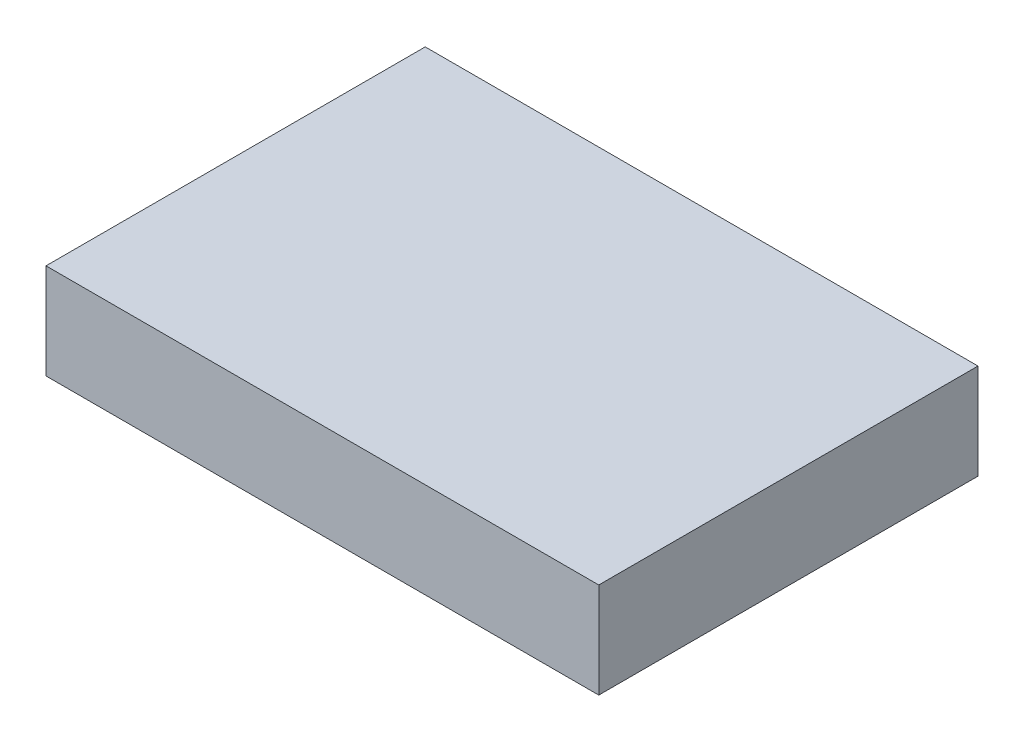
ISO-10303-21;
HEADER;
FILE_DESCRIPTION(('STEP AP214'),'2;1');
FILE_NAME('part.step','',(''),(''),'','','');
FILE_SCHEMA(('AUTOMOTIVE_DESIGN { 1 0 10303 214 1 1 1 1 }'));
ENDSEC;
DATA;
#1=APPLICATION_CONTEXT('core data for automotive mechanical design processes');
#2=APPLICATION_PROTOCOL_DEFINITION('international standard','automotive_design',2000,#1);
#3=PRODUCT_CONTEXT('',#1,'mechanical');
#4=PRODUCT('Part','Part','',(#3));
#5=PRODUCT_RELATED_PRODUCT_CATEGORY('part','',(#4));
#6=PRODUCT_DEFINITION_FORMATION('','',#4);
#7=PRODUCT_DEFINITION_CONTEXT('part definition',#1,'design');
#8=PRODUCT_DEFINITION('design','',#6,#7);
#9=PRODUCT_DEFINITION_SHAPE('','',#8);
#10=(LENGTH_UNIT() NAMED_UNIT(*) SI_UNIT(.MILLI.,.METRE.));
#11=(NAMED_UNIT(*) PLANE_ANGLE_UNIT() SI_UNIT($,.RADIAN.));
#12=(NAMED_UNIT(*) SI_UNIT($,.STERADIAN.) SOLID_ANGLE_UNIT());
#13=UNCERTAINTY_MEASURE_WITH_UNIT(LENGTH_MEASURE(1.E-05),#10,'distance_accuracy_value','');
#14=(GEOMETRIC_REPRESENTATION_CONTEXT(3) GLOBAL_UNCERTAINTY_ASSIGNED_CONTEXT((#13)) GLOBAL_UNIT_ASSIGNED_CONTEXT((#10,
#11,#12)) REPRESENTATION_CONTEXT('',''));
#15=CARTESIAN_POINT('',(0.,0.,0.));
#16=DIRECTION('',(0.,0.,1.));
#17=DIRECTION('',(1.,0.,0.));
#18=AXIS2_PLACEMENT_3D('',#15,#16,#17);
#19=CARTESIAN_POINT('',(0.,25.4,0.));
#20=DIRECTION('',(1.,0.,0.));
#21=DIRECTION('',(0.,0.,-1.));
#22=AXIS2_PLACEMENT_3D('',#19,#20,#21);
#23=PLANE('',#22);
#24=DIRECTION('',(0.,0.,1.));
#25=VECTOR('',#24,1.);
#26=CARTESIAN_POINT('',(0.,0.,0.));
#27=LINE('',#26,#25);
#28=CARTESIAN_POINT('',(0.,0.,-100.979479207466));
#29=VERTEX_POINT('',#28);
#30=CARTESIAN_POINT('',(0.,0.,0.));
#31=VERTEX_POINT('',#30);
#32=EDGE_CURVE('E94',#29,#31,#27,.T.);
#33=ORIENTED_EDGE('',*,*,#32,.T.);
#34=DIRECTION('',(0.,-1.,0.));
#35=VECTOR('',#34,1.);
#36=CARTESIAN_POINT('',(0.,25.4,0.));
#37=LINE('',#36,#35);
#38=CARTESIAN_POINT('',(0.,25.4,0.));
#39=VERTEX_POINT('',#38);
#40=EDGE_CURVE('E11',#39,#31,#37,.T.);
#41=ORIENTED_EDGE('',*,*,#40,.F.);
#42=DIRECTION('',(0.,0.,1.));
#43=VECTOR('',#42,1.);
#44=CARTESIAN_POINT('',(0.,25.4,0.));
#45=LINE('',#44,#43);
#46=CARTESIAN_POINT('',(0.,25.4,-100.979479207466));
#47=VERTEX_POINT('',#46);
#48=EDGE_CURVE('E82',#47,#39,#45,.T.);
#49=ORIENTED_EDGE('',*,*,#48,.F.);
#50=DIRECTION('',(0.,-1.,0.));
#51=VECTOR('',#50,1.);
#52=CARTESIAN_POINT('',(0.,25.4,-100.979479207466));
#53=LINE('',#52,#51);
#54=EDGE_CURVE('E90',#47,#29,#53,.T.);
#55=ORIENTED_EDGE('',*,*,#54,.T.);
#56=EDGE_LOOP('',(#33,#41,#49,#55));
#57=FACE_BOUND('',#56,.T.);
#58=ADVANCED_FACE('F31',(#57),#23,.F.);
#59=CARTESIAN_POINT('',(0.,25.4,0.));
#60=DIRECTION('',(0.,0.,-1.));
#61=DIRECTION('',(-1.,0.,0.));
#62=AXIS2_PLACEMENT_3D('',#59,#60,#61);
#63=PLANE('',#62);
#64=DIRECTION('',(1.,0.,0.));
#65=VECTOR('',#64,1.);
#66=CARTESIAN_POINT('',(0.,0.,0.));
#67=LINE('',#66,#65);
#68=CARTESIAN_POINT('',(147.191865543677,0.,0.));
#69=VERTEX_POINT('',#68);
#70=EDGE_CURVE('E86',#31,#69,#67,.T.);
#71=ORIENTED_EDGE('',*,*,#70,.T.);
#72=DIRECTION('',(0.,-1.,0.));
#73=VECTOR('',#72,1.);
#74=CARTESIAN_POINT('',(147.191865543677,25.4,0.));
#75=LINE('',#74,#73);
#76=CARTESIAN_POINT('',(147.191865543677,25.4,0.));
#77=VERTEX_POINT('',#76);
#78=EDGE_CURVE('E39',#77,#69,#75,.T.);
#79=ORIENTED_EDGE('',*,*,#78,.F.);
#80=DIRECTION('',(1.,0.,0.));
#81=VECTOR('',#80,1.);
#82=CARTESIAN_POINT('',(0.,25.4,0.));
#83=LINE('',#82,#81);
#84=EDGE_CURVE('E77',#39,#77,#83,.T.);
#85=ORIENTED_EDGE('',*,*,#84,.F.);
#86=ORIENTED_EDGE('',*,*,#40,.T.);
#87=EDGE_LOOP('',(#71,#79,#85,#86));
#88=FACE_BOUND('',#87,.T.);
#89=ADVANCED_FACE('F85',(#88),#63,.F.);
#90=CARTESIAN_POINT('',(147.191865543677,25.4,0.));
#91=DIRECTION('',(-1.,0.,0.));
#92=DIRECTION('',(0.,0.,1.));
#93=AXIS2_PLACEMENT_3D('',#90,#91,#92);
#94=PLANE('',#93);
#95=DIRECTION('',(0.,0.,-1.));
#96=VECTOR('',#95,1.);
#97=CARTESIAN_POINT('',(147.191865543677,0.,0.));
#98=LINE('',#97,#96);
#99=CARTESIAN_POINT('',(147.191865543677,0.,-100.979479207466));
#100=VERTEX_POINT('',#99);
#101=EDGE_CURVE('E64',#69,#100,#98,.T.);
#102=ORIENTED_EDGE('',*,*,#101,.T.);
#103=DIRECTION('',(0.,-1.,0.));
#104=VECTOR('',#103,1.);
#105=CARTESIAN_POINT('',(147.191865543677,25.4,-100.979479207466));
#106=LINE('',#105,#104);
#107=CARTESIAN_POINT('',(147.191865543677,25.4,-100.979479207466));
#108=VERTEX_POINT('',#107);
#109=EDGE_CURVE('E87',#108,#100,#106,.T.);
#110=ORIENTED_EDGE('',*,*,#109,.F.);
#111=DIRECTION('',(0.,0.,-1.));
#112=VECTOR('',#111,1.);
#113=CARTESIAN_POINT('',(147.191865543677,25.4,0.));
#114=LINE('',#113,#112);
#115=EDGE_CURVE('E80',#77,#108,#114,.T.);
#116=ORIENTED_EDGE('',*,*,#115,.F.);
#117=ORIENTED_EDGE('',*,*,#78,.T.);
#118=EDGE_LOOP('',(#102,#110,#116,#117));
#119=FACE_BOUND('',#118,.T.);
#120=ADVANCED_FACE('F88',(#119),#94,.F.);
#121=CARTESIAN_POINT('',(0.,25.4,-100.979479207466));
#122=DIRECTION('',(0.,0.,1.));
#123=DIRECTION('',(1.,0.,0.));
#124=AXIS2_PLACEMENT_3D('',#121,#122,#123);
#125=PLANE('',#124);
#126=DIRECTION('',(-1.,0.,0.));
#127=VECTOR('',#126,1.);
#128=CARTESIAN_POINT('',(0.,0.,-100.979479207466));
#129=LINE('',#128,#127);
#130=EDGE_CURVE('E70',#100,#29,#129,.T.);
#131=ORIENTED_EDGE('',*,*,#130,.T.);
#132=ORIENTED_EDGE('',*,*,#54,.F.);
#133=DIRECTION('',(-1.,0.,0.));
#134=VECTOR('',#133,1.);
#135=CARTESIAN_POINT('',(0.,25.4,-100.979479207466));
#136=LINE('',#135,#134);
#137=EDGE_CURVE('E47',#108,#47,#136,.T.);
#138=ORIENTED_EDGE('',*,*,#137,.F.);
#139=ORIENTED_EDGE('',*,*,#109,.T.);
#140=EDGE_LOOP('',(#131,#132,#138,#139));
#141=FACE_BOUND('',#140,.T.);
#142=ADVANCED_FACE('F101',(#141),#125,.F.);
#143=CARTESIAN_POINT('',(0.,25.4,-100.979479207466));
#144=DIRECTION('',(0.,-1.,0.));
#145=DIRECTION('',(0.,0.,-1.));
#146=AXIS2_PLACEMENT_3D('',#143,#144,#145);
#147=PLANE('',#146);
#148=ORIENTED_EDGE('',*,*,#48,.T.);
#149=ORIENTED_EDGE('',*,*,#84,.T.);
#150=ORIENTED_EDGE('',*,*,#115,.T.);
#151=ORIENTED_EDGE('',*,*,#137,.T.);
#152=EDGE_LOOP('',(#148,#149,#150,#151));
#153=FACE_BOUND('',#152,.T.);
#154=ADVANCED_FACE('F78',(#153),#147,.F.);
#155=CARTESIAN_POINT('',(0.,0.,-100.979479207466));
#156=DIRECTION('',(0.,-1.,0.));
#157=DIRECTION('',(0.,0.,-1.));
#158=AXIS2_PLACEMENT_3D('',#155,#156,#157);
#159=PLANE('',#158);
#160=ORIENTED_EDGE('',*,*,#32,.F.);
#161=ORIENTED_EDGE('',*,*,#130,.F.);
#162=ORIENTED_EDGE('',*,*,#101,.F.);
#163=ORIENTED_EDGE('',*,*,#70,.F.);
#164=EDGE_LOOP('',(#160,#161,#162,#163));
#165=FACE_BOUND('',#164,.T.);
#166=ADVANCED_FACE('F104',(#165),#159,.T.);
#167=CLOSED_SHELL('',(#58,#89,#120,#142,#154,#166));
#168=MANIFOLD_SOLID_BREP('B2',#167);
#169=ADVANCED_BREP_SHAPE_REPRESENTATION('',(#18,#168),#14);
#170=SHAPE_DEFINITION_REPRESENTATION(#9,#169);
ENDSEC;
END-ISO-10303-21;
